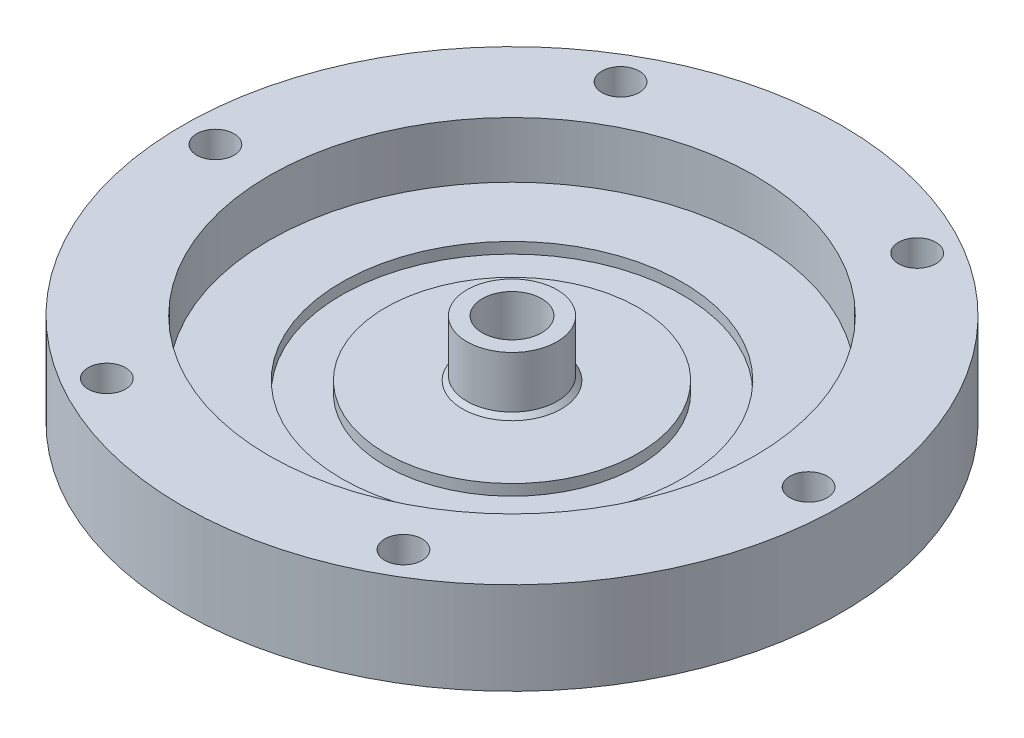
ISO-10303-21;
HEADER;
FILE_DESCRIPTION(('STEP AP214'),'2;1');
FILE_NAME('part.step','',(''),(''),'','','');
FILE_SCHEMA(('AUTOMOTIVE_DESIGN { 1 0 10303 214 1 1 1 1 }'));
ENDSEC;
DATA;
#1=APPLICATION_CONTEXT('core data for automotive mechanical design processes');
#2=APPLICATION_PROTOCOL_DEFINITION('international standard','automotive_design',2000,#1);
#3=PRODUCT_CONTEXT('',#1,'mechanical');
#4=PRODUCT('Part','Part','',(#3));
#5=PRODUCT_RELATED_PRODUCT_CATEGORY('part','',(#4));
#6=PRODUCT_DEFINITION_FORMATION('','',#4);
#7=PRODUCT_DEFINITION_CONTEXT('part definition',#1,'design');
#8=PRODUCT_DEFINITION('design','',#6,#7);
#9=PRODUCT_DEFINITION_SHAPE('','',#8);
#10=(LENGTH_UNIT() NAMED_UNIT(*) SI_UNIT(.MILLI.,.METRE.));
#11=(NAMED_UNIT(*) PLANE_ANGLE_UNIT() SI_UNIT($,.RADIAN.));
#12=(NAMED_UNIT(*) SI_UNIT($,.STERADIAN.) SOLID_ANGLE_UNIT());
#13=UNCERTAINTY_MEASURE_WITH_UNIT(LENGTH_MEASURE(1.E-05),#10,'distance_accuracy_value','');
#14=(GEOMETRIC_REPRESENTATION_CONTEXT(3) GLOBAL_UNCERTAINTY_ASSIGNED_CONTEXT((#13)) GLOBAL_UNIT_ASSIGNED_CONTEXT((#10,
#11,#12)) REPRESENTATION_CONTEXT('',''));
#15=CARTESIAN_POINT('',(0.,0.,0.));
#16=DIRECTION('',(0.,0.,1.));
#17=DIRECTION('',(1.,0.,0.));
#18=AXIS2_PLACEMENT_3D('',#15,#16,#17);
#19=CARTESIAN_POINT('',(30.,0.,0.));
#20=DIRECTION('',(0.,1.,0.));
#21=DIRECTION('',(0.,0.,1.));
#22=AXIS2_PLACEMENT_3D('',#19,#20,#21);
#23=PLANE('',#22);
#24=CARTESIAN_POINT('',(27.,0.,0.));
#25=DIRECTION('',(0.,1.,0.));
#26=DIRECTION('',(0.,0.,1.));
#27=AXIS2_PLACEMENT_3D('',#24,#25,#26);
#28=CIRCLE('',#27,1.7);
#29=CARTESIAN_POINT('',(27.,0.,1.7));
#30=VERTEX_POINT('',#29);
#31=EDGE_CURVE('E119',#30,#30,#28,.T.);
#32=ORIENTED_EDGE('',*,*,#31,.T.);
#33=EDGE_LOOP('',(#32));
#34=FACE_BOUND('',#33,.T.);
#35=CARTESIAN_POINT('',(13.5,0.,-23.3826859021798));
#36=DIRECTION('',(0.,1.,0.));
#37=DIRECTION('',(0.,0.,1.));
#38=AXIS2_PLACEMENT_3D('',#35,#36,#37);
#39=CIRCLE('',#38,1.7);
#40=CARTESIAN_POINT('',(13.5,0.,-21.6826859021798));
#41=VERTEX_POINT('',#40);
#42=EDGE_CURVE('E113',#41,#41,#39,.T.);
#43=ORIENTED_EDGE('',*,*,#42,.T.);
#44=EDGE_LOOP('',(#43));
#45=FACE_BOUND('',#44,.T.);
#46=CARTESIAN_POINT('',(-13.5,0.,-23.3826859021798));
#47=DIRECTION('',(0.,1.,0.));
#48=DIRECTION('',(0.,0.,1.));
#49=AXIS2_PLACEMENT_3D('',#46,#47,#48);
#50=CIRCLE('',#49,1.7);
#51=CARTESIAN_POINT('',(-13.5,0.,-21.6826859021799));
#52=VERTEX_POINT('',#51);
#53=EDGE_CURVE('E107',#52,#52,#50,.T.);
#54=ORIENTED_EDGE('',*,*,#53,.T.);
#55=EDGE_LOOP('',(#54));
#56=FACE_BOUND('',#55,.T.);
#57=CARTESIAN_POINT('',(-27.,0.,0.));
#58=DIRECTION('',(0.,1.,0.));
#59=DIRECTION('',(0.,0.,1.));
#60=AXIS2_PLACEMENT_3D('',#57,#58,#59);
#61=CIRCLE('',#60,1.7);
#62=CARTESIAN_POINT('',(-27.,0.,1.69999999999999));
#63=VERTEX_POINT('',#62);
#64=EDGE_CURVE('E101',#63,#63,#61,.T.);
#65=ORIENTED_EDGE('',*,*,#64,.T.);
#66=EDGE_LOOP('',(#65));
#67=FACE_BOUND('',#66,.T.);
#68=CARTESIAN_POINT('',(-13.5,0.,23.3826859021798));
#69=DIRECTION('',(0.,1.,0.));
#70=DIRECTION('',(0.,0.,1.));
#71=AXIS2_PLACEMENT_3D('',#68,#69,#70);
#72=CIRCLE('',#71,1.7);
#73=CARTESIAN_POINT('',(-13.5,0.,25.0826859021798));
#74=VERTEX_POINT('',#73);
#75=EDGE_CURVE('E95',#74,#74,#72,.T.);
#76=ORIENTED_EDGE('',*,*,#75,.T.);
#77=EDGE_LOOP('',(#76));
#78=FACE_BOUND('',#77,.T.);
#79=CARTESIAN_POINT('',(13.5,0.,23.3826859021799));
#80=DIRECTION('',(0.,1.,0.));
#81=DIRECTION('',(0.,0.,1.));
#82=AXIS2_PLACEMENT_3D('',#79,#80,#81);
#83=CIRCLE('',#82,1.7);
#84=CARTESIAN_POINT('',(13.5,0.,25.0826859021799));
#85=VERTEX_POINT('',#84);
#86=EDGE_CURVE('E89',#85,#85,#83,.T.);
#87=ORIENTED_EDGE('',*,*,#86,.T.);
#88=EDGE_LOOP('',(#87));
#89=FACE_BOUND('',#88,.T.);
#90=CARTESIAN_POINT('',(0.,0.,0.));
#91=DIRECTION('',(0.,1.,0.));
#92=DIRECTION('',(0.,0.,1.));
#93=AXIS2_PLACEMENT_3D('',#90,#91,#92);
#94=CIRCLE('',#93,30.);
#95=CARTESIAN_POINT('',(0.,0.,30.));
#96=VERTEX_POINT('',#95);
#97=EDGE_CURVE('E86',#96,#96,#94,.T.);
#98=ORIENTED_EDGE('',*,*,#97,.F.);
#99=EDGE_LOOP('',(#98));
#100=FACE_BOUND('',#99,.T.);
#101=CARTESIAN_POINT('',(0.,0.,0.));
#102=DIRECTION('',(0.,1.,0.));
#103=DIRECTION('',(0.,0.,1.));
#104=AXIS2_PLACEMENT_3D('',#101,#102,#103);
#105=CIRCLE('',#104,2.7);
#106=CARTESIAN_POINT('',(0.,0.,2.7));
#107=VERTEX_POINT('',#106);
#108=EDGE_CURVE('E53',#107,#107,#105,.T.);
#109=ORIENTED_EDGE('',*,*,#108,.T.);
#110=EDGE_LOOP('',(#109));
#111=FACE_BOUND('',#110,.T.);
#112=ADVANCED_FACE('F41',(#34,#45,#56,#67,#78,#89,#100,#111),#23,.F.);
#113=CARTESIAN_POINT('',(0.,16.3092317708333,0.));
#114=DIRECTION('',(0.,1.,0.));
#115=DIRECTION('',(0.,0.,1.));
#116=AXIS2_PLACEMENT_3D('',#113,#114,#115);
#117=CYLINDRICAL_SURFACE('',#116,2.7);
#118=ORIENTED_EDGE('',*,*,#108,.F.);
#119=EDGE_LOOP('',(#118));
#120=FACE_BOUND('',#119,.T.);
#121=CARTESIAN_POINT('',(0.,8.4,0.));
#122=DIRECTION('',(0.,1.,0.));
#123=DIRECTION('',(0.,0.,1.));
#124=AXIS2_PLACEMENT_3D('',#121,#122,#123);
#125=CIRCLE('',#124,2.7);
#126=CARTESIAN_POINT('',(0.,8.4,2.7));
#127=VERTEX_POINT('',#126);
#128=EDGE_CURVE('E57',#127,#127,#125,.T.);
#129=ORIENTED_EDGE('',*,*,#128,.T.);
#130=EDGE_LOOP('',(#129));
#131=FACE_BOUND('',#130,.T.);
#132=ADVANCED_FACE('F156',(#120,#131),#117,.F.);
#133=CARTESIAN_POINT('',(2.7,8.4,0.));
#134=DIRECTION('',(0.,-1.,0.));
#135=DIRECTION('',(0.,0.,-1.));
#136=AXIS2_PLACEMENT_3D('',#133,#134,#135);
#137=PLANE('',#136);
#138=ORIENTED_EDGE('',*,*,#128,.F.);
#139=EDGE_LOOP('',(#138));
#140=FACE_BOUND('',#139,.T.);
#141=CARTESIAN_POINT('',(0.,8.4,0.));
#142=DIRECTION('',(0.,1.,0.));
#143=DIRECTION('',(0.,0.,1.));
#144=AXIS2_PLACEMENT_3D('',#141,#142,#143);
#145=CIRCLE('',#144,4.1);
#146=CARTESIAN_POINT('',(0.,8.4,4.1));
#147=VERTEX_POINT('',#146);
#148=EDGE_CURVE('E62',#147,#147,#145,.T.);
#149=ORIENTED_EDGE('',*,*,#148,.T.);
#150=EDGE_LOOP('',(#149));
#151=FACE_BOUND('',#150,.T.);
#152=ADVANCED_FACE('F162',(#140,#151),#137,.F.);
#153=CARTESIAN_POINT('',(0.,16.3092317708333,0.));
#154=DIRECTION('',(0.,1.,0.));
#155=DIRECTION('',(0.,0.,1.));
#156=AXIS2_PLACEMENT_3D('',#153,#154,#155);
#157=CYLINDRICAL_SURFACE('',#156,4.1);
#158=CARTESIAN_POINT('',(0.,3.69999999999998,0.));
#159=DIRECTION('',(0.,-1.,0.));
#160=DIRECTION('',(0.,0.,-1.));
#161=AXIS2_PLACEMENT_3D('',#158,#159,#160);
#162=CIRCLE('',#161,4.1);
#163=CARTESIAN_POINT('',(0.,3.69999999999998,-4.1));
#164=VERTEX_POINT('',#163);
#165=EDGE_CURVE('E49',#164,#164,#162,.F.);
#166=ORIENTED_EDGE('',*,*,#165,.T.);
#167=EDGE_LOOP('',(#166));
#168=FACE_BOUND('',#167,.T.);
#169=ORIENTED_EDGE('',*,*,#148,.F.);
#170=EDGE_LOOP('',(#169));
#171=FACE_BOUND('',#170,.T.);
#172=ADVANCED_FACE('F168',(#168,#171),#157,.T.);
#173=CARTESIAN_POINT('',(4.1,3.3,0.));
#174=DIRECTION('',(0.,-1.,0.));
#175=DIRECTION('',(0.,0.,-1.));
#176=AXIS2_PLACEMENT_3D('',#173,#174,#175);
#177=PLANE('',#176);
#178=CARTESIAN_POINT('',(0.,3.3,0.));
#179=DIRECTION('',(0.,-1.,0.));
#180=DIRECTION('',(0.,0.,-1.));
#181=AXIS2_PLACEMENT_3D('',#178,#179,#180);
#182=CIRCLE('',#181,4.49999999999998);
#183=CARTESIAN_POINT('',(0.,3.3,-4.49999999999998));
#184=VERTEX_POINT('',#183);
#185=EDGE_CURVE('E10',#184,#184,#182,.T.);
#186=ORIENTED_EDGE('',*,*,#185,.T.);
#187=EDGE_LOOP('',(#186));
#188=FACE_BOUND('',#187,.T.);
#189=CARTESIAN_POINT('',(0.,3.3,0.));
#190=DIRECTION('',(0.,1.,0.));
#191=DIRECTION('',(0.,0.,1.));
#192=AXIS2_PLACEMENT_3D('',#189,#190,#191);
#193=CIRCLE('',#192,11.5);
#194=CARTESIAN_POINT('',(0.,3.3,11.5));
#195=VERTEX_POINT('',#194);
#196=EDGE_CURVE('E65',#195,#195,#193,.T.);
#197=ORIENTED_EDGE('',*,*,#196,.T.);
#198=EDGE_LOOP('',(#197));
#199=FACE_BOUND('',#198,.T.);
#200=ADVANCED_FACE('F173',(#188,#199),#177,.F.);
#201=CARTESIAN_POINT('',(0.,16.3092317708333,0.));
#202=DIRECTION('',(0.,1.,0.));
#203=DIRECTION('',(0.,0.,1.));
#204=AXIS2_PLACEMENT_3D('',#201,#202,#203);
#205=CYLINDRICAL_SURFACE('',#204,11.5);
#206=ORIENTED_EDGE('',*,*,#196,.F.);
#207=EDGE_LOOP('',(#206));
#208=FACE_BOUND('',#207,.T.);
#209=CARTESIAN_POINT('',(0.,2.3,0.));
#210=DIRECTION('',(0.,1.,0.));
#211=DIRECTION('',(0.,0.,1.));
#212=AXIS2_PLACEMENT_3D('',#209,#210,#211);
#213=CIRCLE('',#212,11.5);
#214=CARTESIAN_POINT('',(0.,2.3,11.5));
#215=VERTEX_POINT('',#214);
#216=EDGE_CURVE('E68',#215,#215,#213,.T.);
#217=ORIENTED_EDGE('',*,*,#216,.T.);
#218=EDGE_LOOP('',(#217));
#219=FACE_BOUND('',#218,.T.);
#220=ADVANCED_FACE('F178',(#208,#219),#205,.T.);
#221=CARTESIAN_POINT('',(11.5,2.3,0.));
#222=DIRECTION('',(0.,-1.,0.));
#223=DIRECTION('',(0.,0.,-1.));
#224=AXIS2_PLACEMENT_3D('',#221,#222,#223);
#225=PLANE('',#224);
#226=ORIENTED_EDGE('',*,*,#216,.F.);
#227=EDGE_LOOP('',(#226));
#228=FACE_BOUND('',#227,.T.);
#229=CARTESIAN_POINT('',(0.,2.3,0.));
#230=DIRECTION('',(0.,1.,0.));
#231=DIRECTION('',(0.,0.,1.));
#232=AXIS2_PLACEMENT_3D('',#229,#230,#231);
#233=CIRCLE('',#232,15.5);
#234=CARTESIAN_POINT('',(0.,2.3,15.5));
#235=VERTEX_POINT('',#234);
#236=EDGE_CURVE('E71',#235,#235,#233,.T.);
#237=ORIENTED_EDGE('',*,*,#236,.T.);
#238=EDGE_LOOP('',(#237));
#239=FACE_BOUND('',#238,.T.);
#240=ADVANCED_FACE('F183',(#228,#239),#225,.F.);
#241=CARTESIAN_POINT('',(0.,16.3092317708333,0.));
#242=DIRECTION('',(0.,1.,0.));
#243=DIRECTION('',(0.,0.,1.));
#244=AXIS2_PLACEMENT_3D('',#241,#242,#243);
#245=CYLINDRICAL_SURFACE('',#244,15.5);
#246=ORIENTED_EDGE('',*,*,#236,.F.);
#247=EDGE_LOOP('',(#246));
#248=FACE_BOUND('',#247,.T.);
#249=CARTESIAN_POINT('',(0.,3.3,0.));
#250=DIRECTION('',(0.,1.,0.));
#251=DIRECTION('',(0.,0.,1.));
#252=AXIS2_PLACEMENT_3D('',#249,#250,#251);
#253=CIRCLE('',#252,15.5);
#254=CARTESIAN_POINT('',(0.,3.3,15.5));
#255=VERTEX_POINT('',#254);
#256=EDGE_CURVE('E74',#255,#255,#253,.T.);
#257=ORIENTED_EDGE('',*,*,#256,.T.);
#258=EDGE_LOOP('',(#257));
#259=FACE_BOUND('',#258,.T.);
#260=ADVANCED_FACE('F187',(#248,#259),#245,.F.);
#261=CARTESIAN_POINT('',(15.5,3.3,0.));
#262=DIRECTION('',(0.,-1.,0.));
#263=DIRECTION('',(0.,0.,-1.));
#264=AXIS2_PLACEMENT_3D('',#261,#262,#263);
#265=PLANE('',#264);
#266=ORIENTED_EDGE('',*,*,#256,.F.);
#267=EDGE_LOOP('',(#266));
#268=FACE_BOUND('',#267,.T.);
#269=CARTESIAN_POINT('',(0.,3.3,0.));
#270=DIRECTION('',(0.,1.,0.));
#271=DIRECTION('',(0.,0.,1.));
#272=AXIS2_PLACEMENT_3D('',#269,#270,#271);
#273=CIRCLE('',#272,22.1);
#274=CARTESIAN_POINT('',(0.,3.3,22.1));
#275=VERTEX_POINT('',#274);
#276=EDGE_CURVE('E77',#275,#275,#273,.T.);
#277=ORIENTED_EDGE('',*,*,#276,.T.);
#278=EDGE_LOOP('',(#277));
#279=FACE_BOUND('',#278,.T.);
#280=ADVANCED_FACE('F191',(#268,#279),#265,.F.);
#281=CARTESIAN_POINT('',(0.,16.3092317708333,0.));
#282=DIRECTION('',(0.,1.,0.));
#283=DIRECTION('',(0.,0.,1.));
#284=AXIS2_PLACEMENT_3D('',#281,#282,#283);
#285=CYLINDRICAL_SURFACE('',#284,22.1);
#286=ORIENTED_EDGE('',*,*,#276,.F.);
#287=EDGE_LOOP('',(#286));
#288=FACE_BOUND('',#287,.T.);
#289=CARTESIAN_POINT('',(0.,8.4,0.));
#290=DIRECTION('',(0.,1.,0.));
#291=DIRECTION('',(0.,0.,1.));
#292=AXIS2_PLACEMENT_3D('',#289,#290,#291);
#293=CIRCLE('',#292,22.1);
#294=CARTESIAN_POINT('',(0.,8.4,22.1));
#295=VERTEX_POINT('',#294);
#296=EDGE_CURVE('E80',#295,#295,#293,.T.);
#297=ORIENTED_EDGE('',*,*,#296,.T.);
#298=EDGE_LOOP('',(#297));
#299=FACE_BOUND('',#298,.T.);
#300=ADVANCED_FACE('F132',(#288,#299),#285,.F.);
#301=CARTESIAN_POINT('',(22.1,8.4,0.));
#302=DIRECTION('',(0.,-1.,0.));
#303=DIRECTION('',(0.,0.,-1.));
#304=AXIS2_PLACEMENT_3D('',#301,#302,#303);
#305=PLANE('',#304);
#306=CARTESIAN_POINT('',(27.,8.4,0.));
#307=DIRECTION('',(0.,1.,0.));
#308=DIRECTION('',(0.,0.,1.));
#309=AXIS2_PLACEMENT_3D('',#306,#307,#308);
#310=CIRCLE('',#309,1.69999999999999);
#311=CARTESIAN_POINT('',(27.,8.4,1.69999999999999));
#312=VERTEX_POINT('',#311);
#313=EDGE_CURVE('E122',#312,#312,#310,.T.);
#314=ORIENTED_EDGE('',*,*,#313,.F.);
#315=EDGE_LOOP('',(#314));
#316=FACE_BOUND('',#315,.T.);
#317=CARTESIAN_POINT('',(13.5,8.4,-23.3826859021798));
#318=DIRECTION('',(0.,1.,0.));
#319=DIRECTION('',(0.,0.,1.));
#320=AXIS2_PLACEMENT_3D('',#317,#318,#319);
#321=CIRCLE('',#320,1.69999999999999);
#322=CARTESIAN_POINT('',(13.5,8.4,-21.6826859021799));
#323=VERTEX_POINT('',#322);
#324=EDGE_CURVE('E116',#323,#323,#321,.T.);
#325=ORIENTED_EDGE('',*,*,#324,.F.);
#326=EDGE_LOOP('',(#325));
#327=FACE_BOUND('',#326,.T.);
#328=CARTESIAN_POINT('',(-13.5,8.4,-23.3826859021798));
#329=DIRECTION('',(0.,1.,0.));
#330=DIRECTION('',(0.,0.,1.));
#331=AXIS2_PLACEMENT_3D('',#328,#329,#330);
#332=CIRCLE('',#331,1.69999999999999);
#333=CARTESIAN_POINT('',(-13.5,8.4,-21.6826859021799));
#334=VERTEX_POINT('',#333);
#335=EDGE_CURVE('E110',#334,#334,#332,.T.);
#336=ORIENTED_EDGE('',*,*,#335,.F.);
#337=EDGE_LOOP('',(#336));
#338=FACE_BOUND('',#337,.T.);
#339=CARTESIAN_POINT('',(-27.,8.4,0.));
#340=DIRECTION('',(0.,1.,0.));
#341=DIRECTION('',(0.,0.,1.));
#342=AXIS2_PLACEMENT_3D('',#339,#340,#341);
#343=CIRCLE('',#342,1.69999999999999);
#344=CARTESIAN_POINT('',(-27.,8.4,1.69999999999998));
#345=VERTEX_POINT('',#344);
#346=EDGE_CURVE('E104',#345,#345,#343,.T.);
#347=ORIENTED_EDGE('',*,*,#346,.F.);
#348=EDGE_LOOP('',(#347));
#349=FACE_BOUND('',#348,.T.);
#350=CARTESIAN_POINT('',(-13.5,8.4,23.3826859021798));
#351=DIRECTION('',(0.,1.,0.));
#352=DIRECTION('',(0.,0.,1.));
#353=AXIS2_PLACEMENT_3D('',#350,#351,#352);
#354=CIRCLE('',#353,1.69999999999999);
#355=CARTESIAN_POINT('',(-13.5,8.4,25.0826859021798));
#356=VERTEX_POINT('',#355);
#357=EDGE_CURVE('E98',#356,#356,#354,.T.);
#358=ORIENTED_EDGE('',*,*,#357,.F.);
#359=EDGE_LOOP('',(#358));
#360=FACE_BOUND('',#359,.T.);
#361=CARTESIAN_POINT('',(13.5,8.4,23.3826859021799));
#362=DIRECTION('',(0.,1.,0.));
#363=DIRECTION('',(0.,0.,1.));
#364=AXIS2_PLACEMENT_3D('',#361,#362,#363);
#365=CIRCLE('',#364,1.69999999999999);
#366=CARTESIAN_POINT('',(13.5,8.4,25.0826859021798));
#367=VERTEX_POINT('',#366);
#368=EDGE_CURVE('E92',#367,#367,#365,.T.);
#369=ORIENTED_EDGE('',*,*,#368,.F.);
#370=EDGE_LOOP('',(#369));
#371=FACE_BOUND('',#370,.T.);
#372=ORIENTED_EDGE('',*,*,#296,.F.);
#373=EDGE_LOOP('',(#372));
#374=FACE_BOUND('',#373,.T.);
#375=CARTESIAN_POINT('',(0.,8.4,0.));
#376=DIRECTION('',(0.,1.,0.));
#377=DIRECTION('',(0.,0.,1.));
#378=AXIS2_PLACEMENT_3D('',#375,#376,#377);
#379=CIRCLE('',#378,30.);
#380=CARTESIAN_POINT('',(0.,8.4,30.));
#381=VERTEX_POINT('',#380);
#382=EDGE_CURVE('E83',#381,#381,#379,.T.);
#383=ORIENTED_EDGE('',*,*,#382,.T.);
#384=EDGE_LOOP('',(#383));
#385=FACE_BOUND('',#384,.T.);
#386=ADVANCED_FACE('F128',(#316,#327,#338,#349,#360,#371,#374,#385),#305,.F.);
#387=CARTESIAN_POINT('',(0.,16.3092317708333,0.));
#388=DIRECTION('',(0.,1.,0.));
#389=DIRECTION('',(0.,0.,1.));
#390=AXIS2_PLACEMENT_3D('',#387,#388,#389);
#391=CYLINDRICAL_SURFACE('',#390,30.);
#392=ORIENTED_EDGE('',*,*,#382,.F.);
#393=EDGE_LOOP('',(#392));
#394=FACE_BOUND('',#393,.T.);
#395=ORIENTED_EDGE('',*,*,#97,.T.);
#396=EDGE_LOOP('',(#395));
#397=FACE_BOUND('',#396,.T.);
#398=ADVANCED_FACE('F131',(#394,#397),#391,.T.);
#399=CARTESIAN_POINT('',(13.5,8.4,23.3826859021799));
#400=DIRECTION('',(0.,1.,0.));
#401=DIRECTION('',(0.,0.,1.));
#402=AXIS2_PLACEMENT_3D('',#399,#400,#401);
#403=CYLINDRICAL_SURFACE('',#402,1.69999999999999);
#404=ORIENTED_EDGE('',*,*,#86,.F.);
#405=EDGE_LOOP('',(#404));
#406=FACE_BOUND('',#405,.T.);
#407=ORIENTED_EDGE('',*,*,#368,.T.);
#408=EDGE_LOOP('',(#407));
#409=FACE_BOUND('',#408,.T.);
#410=ADVANCED_FACE('F150',(#406,#409),#403,.F.);
#411=CARTESIAN_POINT('',(-13.5,8.4,23.3826859021798));
#412=DIRECTION('',(0.,1.,0.));
#413=DIRECTION('',(0.,0.,1.));
#414=AXIS2_PLACEMENT_3D('',#411,#412,#413);
#415=CYLINDRICAL_SURFACE('',#414,1.69999999999999);
#416=ORIENTED_EDGE('',*,*,#75,.F.);
#417=EDGE_LOOP('',(#416));
#418=FACE_BOUND('',#417,.T.);
#419=ORIENTED_EDGE('',*,*,#357,.T.);
#420=EDGE_LOOP('',(#419));
#421=FACE_BOUND('',#420,.T.);
#422=ADVANCED_FACE('F201',(#418,#421),#415,.F.);
#423=CARTESIAN_POINT('',(-27.,8.4,0.));
#424=DIRECTION('',(0.,1.,0.));
#425=DIRECTION('',(0.,0.,1.));
#426=AXIS2_PLACEMENT_3D('',#423,#424,#425);
#427=CYLINDRICAL_SURFACE('',#426,1.69999999999999);
#428=ORIENTED_EDGE('',*,*,#64,.F.);
#429=EDGE_LOOP('',(#428));
#430=FACE_BOUND('',#429,.T.);
#431=ORIENTED_EDGE('',*,*,#346,.T.);
#432=EDGE_LOOP('',(#431));
#433=FACE_BOUND('',#432,.T.);
#434=ADVANCED_FACE('F205',(#430,#433),#427,.F.);
#435=CARTESIAN_POINT('',(-13.5,8.4,-23.3826859021798));
#436=DIRECTION('',(0.,1.,0.));
#437=DIRECTION('',(0.,0.,1.));
#438=AXIS2_PLACEMENT_3D('',#435,#436,#437);
#439=CYLINDRICAL_SURFACE('',#438,1.69999999999999);
#440=ORIENTED_EDGE('',*,*,#53,.F.);
#441=EDGE_LOOP('',(#440));
#442=FACE_BOUND('',#441,.T.);
#443=ORIENTED_EDGE('',*,*,#335,.T.);
#444=EDGE_LOOP('',(#443));
#445=FACE_BOUND('',#444,.T.);
#446=ADVANCED_FACE('F209',(#442,#445),#439,.F.);
#447=CARTESIAN_POINT('',(13.5,8.4,-23.3826859021798));
#448=DIRECTION('',(0.,1.,0.));
#449=DIRECTION('',(0.,0.,1.));
#450=AXIS2_PLACEMENT_3D('',#447,#448,#449);
#451=CYLINDRICAL_SURFACE('',#450,1.69999999999999);
#452=ORIENTED_EDGE('',*,*,#42,.F.);
#453=EDGE_LOOP('',(#452));
#454=FACE_BOUND('',#453,.T.);
#455=ORIENTED_EDGE('',*,*,#324,.T.);
#456=EDGE_LOOP('',(#455));
#457=FACE_BOUND('',#456,.T.);
#458=ADVANCED_FACE('F213',(#454,#457),#451,.F.);
#459=CARTESIAN_POINT('',(27.,8.4,0.));
#460=DIRECTION('',(0.,1.,0.));
#461=DIRECTION('',(0.,0.,1.));
#462=AXIS2_PLACEMENT_3D('',#459,#460,#461);
#463=CYLINDRICAL_SURFACE('',#462,1.69999999999999);
#464=ORIENTED_EDGE('',*,*,#31,.F.);
#465=EDGE_LOOP('',(#464));
#466=FACE_BOUND('',#465,.T.);
#467=ORIENTED_EDGE('',*,*,#313,.T.);
#468=EDGE_LOOP('',(#467));
#469=FACE_BOUND('',#468,.T.);
#470=ADVANCED_FACE('F126',(#466,#469),#463,.F.);
#471=CARTESIAN_POINT('',(0.,3.69999999999998,0.));
#472=DIRECTION('',(0.,-1.,0.));
#473=DIRECTION('',(0.,0.,-1.));
#474=AXIS2_PLACEMENT_3D('',#471,#472,#473);
#475=CONICAL_SURFACE('',#474,4.1,0.785398163397447);
#476=CARTESIAN_POINT('',(0.,3.3,-4.49999999999998));
#477=CARTESIAN_POINT('',(0.,3.30416666666667,-4.49583333333331));
#478=CARTESIAN_POINT('',(0.,3.30833333333333,-4.49166666666664));
#479=CARTESIAN_POINT('',(0.,3.31666666666667,-4.48333333333331));
#480=CARTESIAN_POINT('',(0.,3.32083333333333,-4.47916666666664));
#481=CARTESIAN_POINT('',(0.,3.32916666666667,-4.47083333333331));
#482=CARTESIAN_POINT('',(0.,3.33333333333333,-4.46666666666664));
#483=CARTESIAN_POINT('',(0.,3.34166666666667,-4.45833333333331));
#484=CARTESIAN_POINT('',(0.,3.34583333333333,-4.45416666666664));
#485=CARTESIAN_POINT('',(0.,3.35416666666667,-4.44583333333331));
#486=CARTESIAN_POINT('',(0.,3.35833333333333,-4.44166666666665));
#487=CARTESIAN_POINT('',(0.,3.36666666666666,-4.43333333333331));
#488=CARTESIAN_POINT('',(0.,3.37083333333333,-4.42916666666665));
#489=CARTESIAN_POINT('',(0.,3.37916666666666,-4.42083333333331));
#490=CARTESIAN_POINT('',(0.,3.38333333333333,-4.41666666666665));
#491=CARTESIAN_POINT('',(0.,3.39166666666666,-4.40833333333331));
#492=CARTESIAN_POINT('',(0.,3.39583333333333,-4.40416666666665));
#493=CARTESIAN_POINT('',(0.,3.40416666666666,-4.39583333333332));
#494=CARTESIAN_POINT('',(0.,3.40833333333333,-4.39166666666665));
#495=CARTESIAN_POINT('',(0.,3.41666666666666,-4.38333333333332));
#496=CARTESIAN_POINT('',(0.,3.42083333333333,-4.37916666666665));
#497=CARTESIAN_POINT('',(0.,3.42916666666666,-4.37083333333332));
#498=CARTESIAN_POINT('',(0.,3.43333333333333,-4.36666666666665));
#499=CARTESIAN_POINT('',(0.,3.44166666666666,-4.35833333333332));
#500=CARTESIAN_POINT('',(0.,3.44583333333333,-4.35416666666665));
#501=CARTESIAN_POINT('',(0.,3.45416666666666,-4.34583333333332));
#502=CARTESIAN_POINT('',(0.,3.45833333333333,-4.34166666666665));
#503=CARTESIAN_POINT('',(0.,3.46666666666666,-4.33333333333332));
#504=CARTESIAN_POINT('',(0.,3.47083333333333,-4.32916666666665));
#505=CARTESIAN_POINT('',(0.,3.47916666666666,-4.32083333333332));
#506=CARTESIAN_POINT('',(0.,3.48333333333332,-4.31666666666665));
#507=CARTESIAN_POINT('',(0.,3.49166666666666,-4.30833333333332));
#508=CARTESIAN_POINT('',(0.,3.49583333333332,-4.30416666666665));
#509=CARTESIAN_POINT('',(0.,3.50416666666666,-4.29583333333332));
#510=CARTESIAN_POINT('',(0.,3.50833333333332,-4.29166666666665));
#511=CARTESIAN_POINT('',(0.,3.51666666666666,-4.28333333333332));
#512=CARTESIAN_POINT('',(0.,3.52083333333332,-4.27916666666666));
#513=CARTESIAN_POINT('',(0.,3.52916666666665,-4.27083333333332));
#514=CARTESIAN_POINT('',(0.,3.53333333333332,-4.26666666666666));
#515=CARTESIAN_POINT('',(0.,3.54166666666665,-4.25833333333332));
#516=CARTESIAN_POINT('',(0.,3.54583333333332,-4.25416666666666));
#517=CARTESIAN_POINT('',(0.,3.55416666666665,-4.24583333333332));
#518=CARTESIAN_POINT('',(0.,3.55833333333332,-4.24166666666666));
#519=CARTESIAN_POINT('',(0.,3.56666666666665,-4.23333333333333));
#520=CARTESIAN_POINT('',(0.,3.57083333333332,-4.22916666666666));
#521=CARTESIAN_POINT('',(0.,3.57916666666665,-4.22083333333333));
#522=CARTESIAN_POINT('',(0.,3.58333333333332,-4.21666666666666));
#523=CARTESIAN_POINT('',(0.,3.59166666666665,-4.20833333333333));
#524=CARTESIAN_POINT('',(0.,3.59583333333332,-4.20416666666666));
#525=CARTESIAN_POINT('',(0.,3.60416666666665,-4.19583333333333));
#526=CARTESIAN_POINT('',(0.,3.60833333333332,-4.19166666666666));
#527=CARTESIAN_POINT('',(0.,3.61666666666665,-4.18333333333333));
#528=CARTESIAN_POINT('',(0.,3.62083333333332,-4.17916666666666));
#529=CARTESIAN_POINT('',(0.,3.62916666666665,-4.17083333333333));
#530=CARTESIAN_POINT('',(0.,3.63333333333331,-4.16666666666666));
#531=CARTESIAN_POINT('',(0.,3.64166666666665,-4.15833333333333));
#532=CARTESIAN_POINT('',(0.,3.64583333333331,-4.15416666666666));
#533=CARTESIAN_POINT('',(0.,3.65416666666665,-4.14583333333333));
#534=CARTESIAN_POINT('',(0.,3.65833333333331,-4.14166666666666));
#535=CARTESIAN_POINT('',(0.,3.66666666666665,-4.13333333333333));
#536=CARTESIAN_POINT('',(0.,3.67083333333331,-4.12916666666666));
#537=CARTESIAN_POINT('',(0.,3.67916666666665,-4.12083333333333));
#538=CARTESIAN_POINT('',(0.,3.68333333333331,-4.11666666666667));
#539=CARTESIAN_POINT('',(0.,3.69166666666664,-4.10833333333333));
#540=CARTESIAN_POINT('',(0.,3.69583333333331,-4.10416666666667));
#541=CARTESIAN_POINT('',(0.,3.69999999999998,-4.1));
#542=B_SPLINE_CURVE_WITH_KNOTS('',3,(#476,#477,#478,#479,#480,#481,#482,#483,#484,#485,#486,
#487,#488,#489,#490,#491,#492,#493,#494,#495,#496,#497,#498,#499,#500,#501,#502,#503,#504,#505,
#506,#507,#508,#509,#510,#511,#512,#513,#514,#515,#516,#517,#518,#519,#520,#521,#522,#523,#524,
#525,#526,#527,#528,#529,#530,#531,#532,#533,#534,#535,#536,#537,#538,#539,#540,#541),
.UNSPECIFIED.,.F.,.F.,(4,2,2,2,2,2,2,2,2,2,2,2,2,2,2,2,2,2,2,2,2,2,2,2,2,2,2,2,2,2,2,2,4),(0.,
0.0176776695296627,0.0353553390593256,0.0530330085889877,0.0707106781186504,0.0883883476483133,
0.106066017177975,0.123743686707638,0.141421356237301,0.159099025766964,0.176776695296626,
0.194454364826289,0.212132034355952,0.229809703885614,0.247487373415277,0.265165042944939,
0.282842712474602,0.300520382004264,0.318198051533927,0.335875721063589,0.353553390593252,
0.371231060122915,0.388908729652577,0.40658639918224,0.424264068711903,0.441941738241565,
0.459619407771228,0.47729707730089,0.494974746830553,0.512652416360215,0.530330085889878,
0.548007755419541,0.565685424949203),.UNSPECIFIED.);
#543=EDGE_CURVE('BSEAM44',#184,#164,#542,.T.);
#544=ORIENTED_EDGE('',*,*,#185,.F.);
#545=ORIENTED_EDGE('',*,*,#165,.F.);
#546=ORIENTED_EDGE('',*,*,#543,.T.);
#547=ORIENTED_EDGE('',*,*,#543,.F.);
#548=EDGE_LOOP('',(#544,#546,#545,#547));
#549=FACE_BOUND('',#548,.T.);
#550=ADVANCED_FACE('F44',(#549),#475,.T.);
#551=CLOSED_SHELL('',(#112,#132,#152,#172,#200,#220,#240,#260,#280,#300,#386,#398,#410,#422,
#434,#446,#458,#470,#550));
#552=MANIFOLD_SOLID_BREP('B2',#551);
#553=ADVANCED_BREP_SHAPE_REPRESENTATION('',(#18,#552),#14);
#554=SHAPE_DEFINITION_REPRESENTATION(#9,#553);
ENDSEC;
END-ISO-10303-21;
